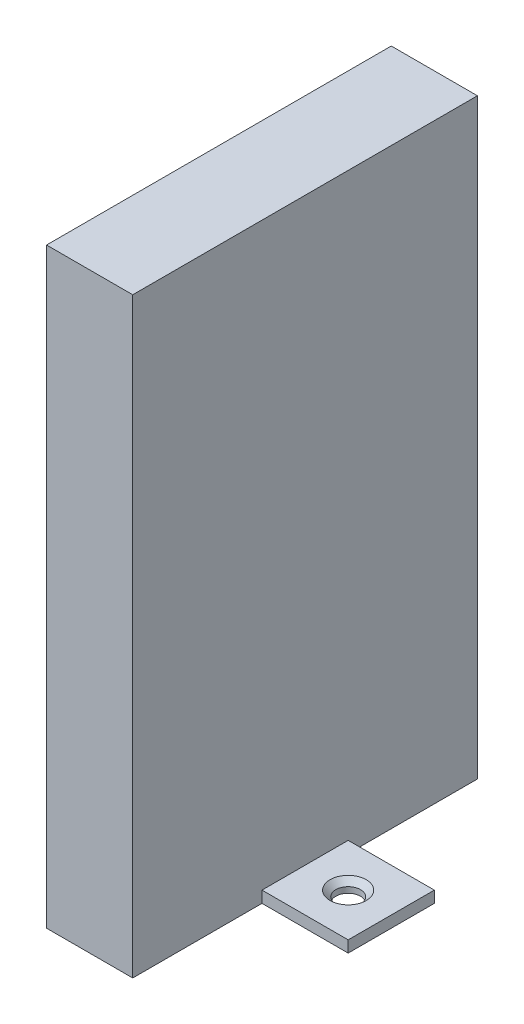
ISO-10303-21;
HEADER;
FILE_DESCRIPTION(('STEP AP214'),'2;1');
FILE_NAME('part.step','',(''),(''),'','','');
FILE_SCHEMA(('AUTOMOTIVE_DESIGN { 1 0 10303 214 1 1 1 1 }'));
ENDSEC;
DATA;
#1=APPLICATION_CONTEXT('core data for automotive mechanical design processes');
#2=APPLICATION_PROTOCOL_DEFINITION('international standard','automotive_design',2000,#1);
#3=PRODUCT_CONTEXT('',#1,'mechanical');
#4=PRODUCT('Part','Part','',(#3));
#5=PRODUCT_RELATED_PRODUCT_CATEGORY('part','',(#4));
#6=PRODUCT_DEFINITION_FORMATION('','',#4);
#7=PRODUCT_DEFINITION_CONTEXT('part definition',#1,'design');
#8=PRODUCT_DEFINITION('design','',#6,#7);
#9=PRODUCT_DEFINITION_SHAPE('','',#8);
#10=(LENGTH_UNIT() NAMED_UNIT(*) SI_UNIT(.MILLI.,.METRE.));
#11=(NAMED_UNIT(*) PLANE_ANGLE_UNIT() SI_UNIT($,.RADIAN.));
#12=(NAMED_UNIT(*) SI_UNIT($,.STERADIAN.) SOLID_ANGLE_UNIT());
#13=UNCERTAINTY_MEASURE_WITH_UNIT(LENGTH_MEASURE(1.E-05),#10,'distance_accuracy_value','');
#14=(GEOMETRIC_REPRESENTATION_CONTEXT(3) GLOBAL_UNCERTAINTY_ASSIGNED_CONTEXT((#13)) GLOBAL_UNIT_ASSIGNED_CONTEXT((#10,
#11,#12)) REPRESENTATION_CONTEXT('',''));
#15=CARTESIAN_POINT('',(0.,0.,0.));
#16=DIRECTION('',(0.,0.,1.));
#17=DIRECTION('',(1.,0.,0.));
#18=AXIS2_PLACEMENT_3D('',#15,#16,#17);
#19=CARTESIAN_POINT('',(0.,103.,0.));
#20=DIRECTION('',(1.,0.,0.));
#21=DIRECTION('',(0.,0.,-1.));
#22=AXIS2_PLACEMENT_3D('',#19,#20,#21);
#23=PLANE('',#22);
#24=DIRECTION('',(0.,-1.,0.));
#25=VECTOR('',#24,1.);
#26=CARTESIAN_POINT('',(0.,0.,-37.5));
#27=LINE('',#26,#25);
#28=CARTESIAN_POINT('',(0.,2.,-37.5));
#29=VERTEX_POINT('',#28);
#30=CARTESIAN_POINT('',(0.,0.,-37.5));
#31=VERTEX_POINT('',#30);
#32=EDGE_CURVE('E64',#29,#31,#27,.T.);
#33=ORIENTED_EDGE('',*,*,#32,.F.);
#34=DIRECTION('',(0.,0.,-1.));
#35=VECTOR('',#34,1.);
#36=CARTESIAN_POINT('',(0.,2.,-37.5));
#37=LINE('',#36,#35);
#38=CARTESIAN_POINT('',(0.,2.,-22.5));
#39=VERTEX_POINT('',#38);
#40=EDGE_CURVE('E326',#39,#29,#37,.T.);
#41=ORIENTED_EDGE('',*,*,#40,.F.);
#42=DIRECTION('',(0.,1.,0.));
#43=VECTOR('',#42,1.);
#44=CARTESIAN_POINT('',(0.,2.,-22.5));
#45=LINE('',#44,#43);
#46=CARTESIAN_POINT('',(0.,0.,-22.5));
#47=VERTEX_POINT('',#46);
#48=EDGE_CURVE('E70',#47,#39,#45,.T.);
#49=ORIENTED_EDGE('',*,*,#48,.F.);
#50=DIRECTION('',(0.,0.,1.));
#51=VECTOR('',#50,1.);
#52=CARTESIAN_POINT('',(0.,0.,0.));
#53=LINE('',#52,#51);
#54=CARTESIAN_POINT('',(0.,0.,0.));
#55=VERTEX_POINT('',#54);
#56=EDGE_CURVE('E161',#47,#55,#53,.T.);
#57=ORIENTED_EDGE('',*,*,#56,.T.);
#58=DIRECTION('',(0.,-1.,0.));
#59=VECTOR('',#58,1.);
#60=CARTESIAN_POINT('',(0.,103.,0.));
#61=LINE('',#60,#59);
#62=CARTESIAN_POINT('',(0.,103.,0.));
#63=VERTEX_POINT('',#62);
#64=EDGE_CURVE('E225',#63,#55,#61,.T.);
#65=ORIENTED_EDGE('',*,*,#64,.F.);
#66=DIRECTION('',(0.,0.,1.));
#67=VECTOR('',#66,1.);
#68=CARTESIAN_POINT('',(0.,103.,0.));
#69=LINE('',#68,#67);
#70=CARTESIAN_POINT('',(0.,103.,-60.));
#71=VERTEX_POINT('',#70);
#72=EDGE_CURVE('E222',#71,#63,#69,.T.);
#73=ORIENTED_EDGE('',*,*,#72,.F.);
#74=DIRECTION('',(0.,-1.,0.));
#75=VECTOR('',#74,1.);
#76=CARTESIAN_POINT('',(0.,103.,-60.));
#77=LINE('',#76,#75);
#78=CARTESIAN_POINT('',(0.,0.,-60.));
#79=VERTEX_POINT('',#78);
#80=EDGE_CURVE('E241',#71,#79,#77,.T.);
#81=ORIENTED_EDGE('',*,*,#80,.T.);
#82=EDGE_CURVE('E216',#79,#31,#53,.T.);
#83=ORIENTED_EDGE('',*,*,#82,.T.);
#84=EDGE_LOOP('',(#33,#41,#49,#57,#65,#73,#81,#83));
#85=FACE_BOUND('',#84,.T.);
#86=ADVANCED_FACE('F47',(#85),#23,.F.);
#87=CARTESIAN_POINT('',(15.,103.,-60.));
#88=DIRECTION('',(-1.,0.,0.));
#89=DIRECTION('',(0.,0.,1.));
#90=AXIS2_PLACEMENT_3D('',#87,#88,#89);
#91=PLANE('',#90);
#92=DIRECTION('',(0.,-1.,0.));
#93=VECTOR('',#92,1.);
#94=CARTESIAN_POINT('',(15.,0.,-22.5));
#95=LINE('',#94,#93);
#96=CARTESIAN_POINT('',(15.,2.,-22.5));
#97=VERTEX_POINT('',#96);
#98=CARTESIAN_POINT('',(15.,0.,-22.5));
#99=VERTEX_POINT('',#98);
#100=EDGE_CURVE('E179',#97,#99,#95,.T.);
#101=ORIENTED_EDGE('',*,*,#100,.F.);
#102=DIRECTION('',(0.,0.,1.));
#103=VECTOR('',#102,1.);
#104=CARTESIAN_POINT('',(15.,2.,-22.5));
#105=LINE('',#104,#103);
#106=CARTESIAN_POINT('',(15.,2.,-37.5));
#107=VERTEX_POINT('',#106);
#108=EDGE_CURVE('E168',#107,#97,#105,.T.);
#109=ORIENTED_EDGE('',*,*,#108,.F.);
#110=DIRECTION('',(0.,1.,0.));
#111=VECTOR('',#110,1.);
#112=CARTESIAN_POINT('',(15.,2.,-37.5));
#113=LINE('',#112,#111);
#114=CARTESIAN_POINT('',(15.,0.,-37.5));
#115=VERTEX_POINT('',#114);
#116=EDGE_CURVE('E163',#115,#107,#113,.T.);
#117=ORIENTED_EDGE('',*,*,#116,.F.);
#118=DIRECTION('',(0.,0.,-1.));
#119=VECTOR('',#118,1.);
#120=CARTESIAN_POINT('',(15.,0.,-60.));
#121=LINE('',#120,#119);
#122=CARTESIAN_POINT('',(15.,0.,-60.));
#123=VERTEX_POINT('',#122);
#124=EDGE_CURVE('E229',#115,#123,#121,.T.);
#125=ORIENTED_EDGE('',*,*,#124,.T.);
#126=DIRECTION('',(0.,-1.,0.));
#127=VECTOR('',#126,1.);
#128=CARTESIAN_POINT('',(15.,103.,-60.));
#129=LINE('',#128,#127);
#130=CARTESIAN_POINT('',(15.,103.,-60.));
#131=VERTEX_POINT('',#130);
#132=EDGE_CURVE('E245',#131,#123,#129,.T.);
#133=ORIENTED_EDGE('',*,*,#132,.F.);
#134=DIRECTION('',(0.,0.,-1.));
#135=VECTOR('',#134,1.);
#136=CARTESIAN_POINT('',(15.,103.,-60.));
#137=LINE('',#136,#135);
#138=CARTESIAN_POINT('',(15.,103.,0.));
#139=VERTEX_POINT('',#138);
#140=EDGE_CURVE('E215',#139,#131,#137,.T.);
#141=ORIENTED_EDGE('',*,*,#140,.F.);
#142=DIRECTION('',(0.,-1.,0.));
#143=VECTOR('',#142,1.);
#144=CARTESIAN_POINT('',(15.,103.,0.));
#145=LINE('',#144,#143);
#146=CARTESIAN_POINT('',(15.,0.,0.));
#147=VERTEX_POINT('',#146);
#148=EDGE_CURVE('E249',#139,#147,#145,.T.);
#149=ORIENTED_EDGE('',*,*,#148,.T.);
#150=EDGE_CURVE('E230',#147,#99,#121,.T.);
#151=ORIENTED_EDGE('',*,*,#150,.T.);
#152=EDGE_LOOP('',(#101,#109,#117,#125,#133,#141,#149,#151));
#153=FACE_BOUND('',#152,.T.);
#154=ADVANCED_FACE('F277',(#153),#91,.F.);
#155=CARTESIAN_POINT('',(15.,103.,0.));
#156=DIRECTION('',(0.,0.,-1.));
#157=DIRECTION('',(-1.,0.,0.));
#158=AXIS2_PLACEMENT_3D('',#155,#156,#157);
#159=PLANE('',#158);
#160=DIRECTION('',(1.,0.,0.));
#161=VECTOR('',#160,1.);
#162=CARTESIAN_POINT('',(15.,0.,0.));
#163=LINE('',#162,#161);
#164=EDGE_CURVE('E210',#55,#147,#163,.T.);
#165=ORIENTED_EDGE('',*,*,#164,.T.);
#166=ORIENTED_EDGE('',*,*,#148,.F.);
#167=DIRECTION('',(1.,0.,0.));
#168=VECTOR('',#167,1.);
#169=CARTESIAN_POINT('',(15.,103.,0.));
#170=LINE('',#169,#168);
#171=EDGE_CURVE('E211',#63,#139,#170,.T.);
#172=ORIENTED_EDGE('',*,*,#171,.F.);
#173=ORIENTED_EDGE('',*,*,#64,.T.);
#174=EDGE_LOOP('',(#165,#166,#172,#173));
#175=FACE_BOUND('',#174,.T.);
#176=ADVANCED_FACE('F284',(#175),#159,.F.);
#177=CARTESIAN_POINT('',(0.,103.,-60.));
#178=DIRECTION('',(0.,0.,1.));
#179=DIRECTION('',(1.,0.,0.));
#180=AXIS2_PLACEMENT_3D('',#177,#178,#179);
#181=PLANE('',#180);
#182=DIRECTION('',(-1.,0.,0.));
#183=VECTOR('',#182,1.);
#184=CARTESIAN_POINT('',(0.,0.,-60.));
#185=LINE('',#184,#183);
#186=EDGE_CURVE('E233',#123,#79,#185,.T.);
#187=ORIENTED_EDGE('',*,*,#186,.T.);
#188=ORIENTED_EDGE('',*,*,#80,.F.);
#189=DIRECTION('',(-1.,0.,0.));
#190=VECTOR('',#189,1.);
#191=CARTESIAN_POINT('',(0.,103.,-60.));
#192=LINE('',#191,#190);
#193=EDGE_CURVE('E219',#131,#71,#192,.T.);
#194=ORIENTED_EDGE('',*,*,#193,.F.);
#195=ORIENTED_EDGE('',*,*,#132,.T.);
#196=EDGE_LOOP('',(#187,#188,#194,#195));
#197=FACE_BOUND('',#196,.T.);
#198=ADVANCED_FACE('F290',(#197),#181,.F.);
#199=CARTESIAN_POINT('',(0.,103.,0.));
#200=DIRECTION('',(0.,-1.,0.));
#201=DIRECTION('',(0.,0.,-1.));
#202=AXIS2_PLACEMENT_3D('',#199,#200,#201);
#203=PLANE('',#202);
#204=ORIENTED_EDGE('',*,*,#171,.T.);
#205=ORIENTED_EDGE('',*,*,#140,.T.);
#206=ORIENTED_EDGE('',*,*,#193,.T.);
#207=ORIENTED_EDGE('',*,*,#72,.T.);
#208=EDGE_LOOP('',(#204,#205,#206,#207));
#209=FACE_BOUND('',#208,.T.);
#210=ADVANCED_FACE('F292',(#209),#203,.F.);
#211=CARTESIAN_POINT('',(0.,0.,0.));
#212=DIRECTION('',(0.,-1.,0.));
#213=DIRECTION('',(0.,0.,-1.));
#214=AXIS2_PLACEMENT_3D('',#211,#212,#213);
#215=PLANE('',#214);
#216=CARTESIAN_POINT('',(22.5,0.,-30.));
#217=DIRECTION('',(0.,-1.,0.));
#218=DIRECTION('',(0.,0.,-1.));
#219=AXIS2_PLACEMENT_3D('',#216,#217,#218);
#220=CIRCLE('',#219,2.15);
#221=CARTESIAN_POINT('',(22.5,0.,-32.15));
#222=VERTEX_POINT('',#221);
#223=EDGE_CURVE('E339',#222,#222,#220,.T.);
#224=ORIENTED_EDGE('',*,*,#223,.F.);
#225=EDGE_LOOP('',(#224));
#226=FACE_BOUND('',#225,.T.);
#227=CARTESIAN_POINT('',(-7.50000000000001,0.,-30.));
#228=DIRECTION('',(0.,-1.,0.));
#229=DIRECTION('',(0.,0.,-1.));
#230=AXIS2_PLACEMENT_3D('',#227,#228,#229);
#231=CIRCLE('',#230,2.15);
#232=CARTESIAN_POINT('',(-7.50000000000001,0.,-32.15));
#233=VERTEX_POINT('',#232);
#234=EDGE_CURVE('E342',#233,#233,#231,.T.);
#235=ORIENTED_EDGE('',*,*,#234,.F.);
#236=EDGE_LOOP('',(#235));
#237=FACE_BOUND('',#236,.T.);
#238=ORIENTED_EDGE('',*,*,#164,.F.);
#239=ORIENTED_EDGE('',*,*,#56,.F.);
#240=DIRECTION('',(1.,0.,0.));
#241=VECTOR('',#240,1.);
#242=CARTESIAN_POINT('',(-15.,0.,-22.5));
#243=LINE('',#242,#241);
#244=CARTESIAN_POINT('',(-15.,0.,-22.5));
#245=VERTEX_POINT('',#244);
#246=EDGE_CURVE('E141',#245,#47,#243,.T.);
#247=ORIENTED_EDGE('',*,*,#246,.F.);
#248=DIRECTION('',(0.,0.,1.));
#249=VECTOR('',#248,1.);
#250=CARTESIAN_POINT('',(-15.,0.,-22.5));
#251=LINE('',#250,#249);
#252=CARTESIAN_POINT('',(-15.,0.,-37.5));
#253=VERTEX_POINT('',#252);
#254=EDGE_CURVE('E148',#253,#245,#251,.T.);
#255=ORIENTED_EDGE('',*,*,#254,.F.);
#256=DIRECTION('',(1.,0.,0.));
#257=VECTOR('',#256,1.);
#258=CARTESIAN_POINT('',(-15.,0.,-37.5));
#259=LINE('',#258,#257);
#260=EDGE_CURVE('E320',#253,#31,#259,.T.);
#261=ORIENTED_EDGE('',*,*,#260,.T.);
#262=ORIENTED_EDGE('',*,*,#82,.F.);
#263=ORIENTED_EDGE('',*,*,#186,.F.);
#264=ORIENTED_EDGE('',*,*,#124,.F.);
#265=DIRECTION('',(-1.,0.,0.));
#266=VECTOR('',#265,1.);
#267=CARTESIAN_POINT('',(30.,0.,-37.5));
#268=LINE('',#267,#266);
#269=CARTESIAN_POINT('',(30.,0.,-37.5));
#270=VERTEX_POINT('',#269);
#271=EDGE_CURVE('E206',#270,#115,#268,.T.);
#272=ORIENTED_EDGE('',*,*,#271,.F.);
#273=DIRECTION('',(0.,0.,-1.));
#274=VECTOR('',#273,1.);
#275=CARTESIAN_POINT('',(30.,0.,-37.5));
#276=LINE('',#275,#274);
#277=CARTESIAN_POINT('',(30.,0.,-22.5));
#278=VERTEX_POINT('',#277);
#279=EDGE_CURVE('E174',#278,#270,#276,.T.);
#280=ORIENTED_EDGE('',*,*,#279,.F.);
#281=DIRECTION('',(-1.,0.,0.));
#282=VECTOR('',#281,1.);
#283=CARTESIAN_POINT('',(30.,0.,-22.5));
#284=LINE('',#283,#282);
#285=EDGE_CURVE('E187',#278,#99,#284,.T.);
#286=ORIENTED_EDGE('',*,*,#285,.T.);
#287=ORIENTED_EDGE('',*,*,#150,.F.);
#288=EDGE_LOOP('',(#238,#239,#247,#255,#261,#262,#263,#264,#272,#280,#286,#287));
#289=FACE_BOUND('',#288,.T.);
#290=ADVANCED_FACE('F160',(#226,#237,#289),#215,.T.);
#291=CARTESIAN_POINT('',(30.,2.,-37.5));
#292=DIRECTION('',(0.,0.,1.));
#293=DIRECTION('',(1.,0.,0.));
#294=AXIS2_PLACEMENT_3D('',#291,#292,#293);
#295=PLANE('',#294);
#296=ORIENTED_EDGE('',*,*,#116,.T.);
#297=DIRECTION('',(-1.,0.,0.));
#298=VECTOR('',#297,1.);
#299=CARTESIAN_POINT('',(30.,2.,-37.5));
#300=LINE('',#299,#298);
#301=CARTESIAN_POINT('',(30.,2.,-37.5));
#302=VERTEX_POINT('',#301);
#303=EDGE_CURVE('E202',#302,#107,#300,.T.);
#304=ORIENTED_EDGE('',*,*,#303,.F.);
#305=DIRECTION('',(0.,1.,0.));
#306=VECTOR('',#305,1.);
#307=CARTESIAN_POINT('',(30.,2.,-37.5));
#308=LINE('',#307,#306);
#309=EDGE_CURVE('E178',#270,#302,#308,.T.);
#310=ORIENTED_EDGE('',*,*,#309,.F.);
#311=ORIENTED_EDGE('',*,*,#271,.T.);
#312=EDGE_LOOP('',(#296,#304,#310,#311));
#313=FACE_BOUND('',#312,.T.);
#314=ADVANCED_FACE('F352',(#313),#295,.F.);
#315=CARTESIAN_POINT('',(30.,2.,-22.5));
#316=DIRECTION('',(0.,-1.,0.));
#317=DIRECTION('',(0.,0.,-1.));
#318=AXIS2_PLACEMENT_3D('',#315,#316,#317);
#319=PLANE('',#318);
#320=CARTESIAN_POINT('',(22.5,2.,-30.));
#321=DIRECTION('',(0.,-1.,0.));
#322=DIRECTION('',(0.,0.,-1.));
#323=AXIS2_PLACEMENT_3D('',#320,#321,#322);
#324=CIRCLE('',#323,3.15);
#325=CARTESIAN_POINT('',(22.5,2.,-33.15));
#326=VERTEX_POINT('',#325);
#327=EDGE_CURVE('E257',#326,#326,#324,.T.);
#328=ORIENTED_EDGE('',*,*,#327,.T.);
#329=EDGE_LOOP('',(#328));
#330=FACE_BOUND('',#329,.T.);
#331=ORIENTED_EDGE('',*,*,#108,.T.);
#332=DIRECTION('',(-1.,0.,0.));
#333=VECTOR('',#332,1.);
#334=CARTESIAN_POINT('',(30.,2.,-22.5));
#335=LINE('',#334,#333);
#336=CARTESIAN_POINT('',(30.,2.,-22.5));
#337=VERTEX_POINT('',#336);
#338=EDGE_CURVE('E198',#337,#97,#335,.T.);
#339=ORIENTED_EDGE('',*,*,#338,.F.);
#340=DIRECTION('',(0.,0.,1.));
#341=VECTOR('',#340,1.);
#342=CARTESIAN_POINT('',(30.,2.,-22.5));
#343=LINE('',#342,#341);
#344=EDGE_CURVE('E182',#302,#337,#343,.T.);
#345=ORIENTED_EDGE('',*,*,#344,.F.);
#346=ORIENTED_EDGE('',*,*,#303,.T.);
#347=EDGE_LOOP('',(#331,#339,#345,#346));
#348=FACE_BOUND('',#347,.T.);
#349=ADVANCED_FACE('F359',(#330,#348),#319,.F.);
#350=CARTESIAN_POINT('',(30.,0.,-22.5));
#351=DIRECTION('',(0.,0.,-1.));
#352=DIRECTION('',(-1.,0.,0.));
#353=AXIS2_PLACEMENT_3D('',#350,#351,#352);
#354=PLANE('',#353);
#355=ORIENTED_EDGE('',*,*,#100,.T.);
#356=ORIENTED_EDGE('',*,*,#285,.F.);
#357=DIRECTION('',(0.,-1.,0.));
#358=VECTOR('',#357,1.);
#359=CARTESIAN_POINT('',(30.,0.,-22.5));
#360=LINE('',#359,#358);
#361=EDGE_CURVE('E185',#337,#278,#360,.T.);
#362=ORIENTED_EDGE('',*,*,#361,.F.);
#363=ORIENTED_EDGE('',*,*,#338,.T.);
#364=EDGE_LOOP('',(#355,#356,#362,#363));
#365=FACE_BOUND('',#364,.T.);
#366=ADVANCED_FACE('F367',(#365),#354,.F.);
#367=CARTESIAN_POINT('',(30.,0.,0.));
#368=DIRECTION('',(-1.,0.,0.));
#369=DIRECTION('',(0.,0.,1.));
#370=AXIS2_PLACEMENT_3D('',#367,#368,#369);
#371=PLANE('',#370);
#372=ORIENTED_EDGE('',*,*,#279,.T.);
#373=ORIENTED_EDGE('',*,*,#309,.T.);
#374=ORIENTED_EDGE('',*,*,#344,.T.);
#375=ORIENTED_EDGE('',*,*,#361,.T.);
#376=EDGE_LOOP('',(#372,#373,#374,#375));
#377=FACE_BOUND('',#376,.T.);
#378=ADVANCED_FACE('F371',(#377),#371,.F.);
#379=CARTESIAN_POINT('',(-15.,2.,-22.5));
#380=DIRECTION('',(0.,0.,-1.));
#381=DIRECTION('',(-1.,0.,0.));
#382=AXIS2_PLACEMENT_3D('',#379,#380,#381);
#383=PLANE('',#382);
#384=ORIENTED_EDGE('',*,*,#48,.T.);
#385=DIRECTION('',(1.,0.,0.));
#386=VECTOR('',#385,1.);
#387=CARTESIAN_POINT('',(-15.,2.,-22.5));
#388=LINE('',#387,#386);
#389=CARTESIAN_POINT('',(-15.,2.,-22.5));
#390=VERTEX_POINT('',#389);
#391=EDGE_CURVE('E143',#390,#39,#388,.T.);
#392=ORIENTED_EDGE('',*,*,#391,.F.);
#393=DIRECTION('',(0.,1.,0.));
#394=VECTOR('',#393,1.);
#395=CARTESIAN_POINT('',(-15.,2.,-22.5));
#396=LINE('',#395,#394);
#397=EDGE_CURVE('E137',#245,#390,#396,.T.);
#398=ORIENTED_EDGE('',*,*,#397,.F.);
#399=ORIENTED_EDGE('',*,*,#246,.T.);
#400=EDGE_LOOP('',(#384,#392,#398,#399));
#401=FACE_BOUND('',#400,.T.);
#402=ADVANCED_FACE('F139',(#401),#383,.F.);
#403=CARTESIAN_POINT('',(-15.,2.,-37.5));
#404=DIRECTION('',(0.,-1.,0.));
#405=DIRECTION('',(0.,0.,-1.));
#406=AXIS2_PLACEMENT_3D('',#403,#404,#405);
#407=PLANE('',#406);
#408=CARTESIAN_POINT('',(-7.50000000000001,2.,-30.));
#409=DIRECTION('',(0.,-1.,0.));
#410=DIRECTION('',(0.,0.,-1.));
#411=AXIS2_PLACEMENT_3D('',#408,#409,#410);
#412=CIRCLE('',#411,3.15);
#413=CARTESIAN_POINT('',(-7.50000000000001,2.,-33.15));
#414=VERTEX_POINT('',#413);
#415=EDGE_CURVE('E11',#414,#414,#412,.T.);
#416=ORIENTED_EDGE('',*,*,#415,.T.);
#417=EDGE_LOOP('',(#416));
#418=FACE_BOUND('',#417,.T.);
#419=ORIENTED_EDGE('',*,*,#40,.T.);
#420=DIRECTION('',(1.,0.,0.));
#421=VECTOR('',#420,1.);
#422=CARTESIAN_POINT('',(-15.,2.,-37.5));
#423=LINE('',#422,#421);
#424=CARTESIAN_POINT('',(-15.,2.,-37.5));
#425=VERTEX_POINT('',#424);
#426=EDGE_CURVE('E170',#425,#29,#423,.T.);
#427=ORIENTED_EDGE('',*,*,#426,.F.);
#428=DIRECTION('',(0.,0.,-1.));
#429=VECTOR('',#428,1.);
#430=CARTESIAN_POINT('',(-15.,2.,-37.5));
#431=LINE('',#430,#429);
#432=EDGE_CURVE('E147',#390,#425,#431,.T.);
#433=ORIENTED_EDGE('',*,*,#432,.F.);
#434=ORIENTED_EDGE('',*,*,#391,.T.);
#435=EDGE_LOOP('',(#419,#427,#433,#434));
#436=FACE_BOUND('',#435,.T.);
#437=ADVANCED_FACE('F376',(#418,#436),#407,.F.);
#438=CARTESIAN_POINT('',(-15.,0.,-37.5));
#439=DIRECTION('',(0.,0.,1.));
#440=DIRECTION('',(1.,0.,0.));
#441=AXIS2_PLACEMENT_3D('',#438,#439,#440);
#442=PLANE('',#441);
#443=ORIENTED_EDGE('',*,*,#32,.T.);
#444=ORIENTED_EDGE('',*,*,#260,.F.);
#445=DIRECTION('',(0.,-1.,0.));
#446=VECTOR('',#445,1.);
#447=CARTESIAN_POINT('',(-15.,0.,-37.5));
#448=LINE('',#447,#446);
#449=EDGE_CURVE('E153',#425,#253,#448,.T.);
#450=ORIENTED_EDGE('',*,*,#449,.F.);
#451=ORIENTED_EDGE('',*,*,#426,.T.);
#452=EDGE_LOOP('',(#443,#444,#450,#451));
#453=FACE_BOUND('',#452,.T.);
#454=ADVANCED_FACE('F323',(#453),#442,.F.);
#455=CARTESIAN_POINT('',(-15.,0.,0.));
#456=DIRECTION('',(1.,0.,0.));
#457=DIRECTION('',(0.,0.,-1.));
#458=AXIS2_PLACEMENT_3D('',#455,#456,#457);
#459=PLANE('',#458);
#460=ORIENTED_EDGE('',*,*,#254,.T.);
#461=ORIENTED_EDGE('',*,*,#397,.T.);
#462=ORIENTED_EDGE('',*,*,#432,.T.);
#463=ORIENTED_EDGE('',*,*,#449,.T.);
#464=EDGE_LOOP('',(#460,#461,#462,#463));
#465=FACE_BOUND('',#464,.T.);
#466=ADVANCED_FACE('F151',(#465),#459,.F.);
#467=CARTESIAN_POINT('',(-7.50000000000001,-13.,-30.));
#468=DIRECTION('',(0.,1.,0.));
#469=DIRECTION('',(0.,0.,1.));
#470=AXIS2_PLACEMENT_3D('',#467,#468,#469);
#471=CYLINDRICAL_SURFACE('',#470,2.15);
#472=CARTESIAN_POINT('',(-7.50000000000001,1.00000000000001,-30.));
#473=DIRECTION('',(0.,-1.,0.));
#474=DIRECTION('',(0.,0.,-1.));
#475=AXIS2_PLACEMENT_3D('',#472,#473,#474);
#476=CIRCLE('',#475,2.15);
#477=CARTESIAN_POINT('',(-7.50000000000001,1.00000000000001,-32.15));
#478=VERTEX_POINT('',#477);
#479=EDGE_CURVE('E57',#478,#478,#476,.F.);
#480=ORIENTED_EDGE('',*,*,#479,.T.);
#481=EDGE_LOOP('',(#480));
#482=FACE_BOUND('',#481,.T.);
#483=ORIENTED_EDGE('',*,*,#234,.T.);
#484=EDGE_LOOP('',(#483));
#485=FACE_BOUND('',#484,.T.);
#486=ADVANCED_FACE('F264',(#482,#485),#471,.F.);
#487=CARTESIAN_POINT('',(22.5,-13.,-30.));
#488=DIRECTION('',(0.,1.,0.));
#489=DIRECTION('',(0.,0.,1.));
#490=AXIS2_PLACEMENT_3D('',#487,#488,#489);
#491=CYLINDRICAL_SURFACE('',#490,2.15);
#492=CARTESIAN_POINT('',(22.5,1.,-30.));
#493=DIRECTION('',(0.,-1.,0.));
#494=DIRECTION('',(0.,0.,-1.));
#495=AXIS2_PLACEMENT_3D('',#492,#493,#494);
#496=CIRCLE('',#495,2.15);
#497=CARTESIAN_POINT('',(22.5,1.,-32.15));
#498=VERTEX_POINT('',#497);
#499=EDGE_CURVE('E253',#498,#498,#496,.F.);
#500=ORIENTED_EDGE('',*,*,#499,.T.);
#501=EDGE_LOOP('',(#500));
#502=FACE_BOUND('',#501,.T.);
#503=ORIENTED_EDGE('',*,*,#223,.T.);
#504=EDGE_LOOP('',(#503));
#505=FACE_BOUND('',#504,.T.);
#506=ADVANCED_FACE('F273',(#502,#505),#491,.F.);
#507=CARTESIAN_POINT('',(22.5,1.,-30.));
#508=DIRECTION('',(0.,1.,0.));
#509=DIRECTION('',(0.,0.,1.));
#510=AXIS2_PLACEMENT_3D('',#507,#508,#509);
#511=CONICAL_SURFACE('',#510,2.15,0.785398163397451);
#512=ORIENTED_EDGE('',*,*,#327,.F.);
#513=EDGE_LOOP('',(#512));
#514=FACE_BOUND('',#513,.T.);
#515=ORIENTED_EDGE('',*,*,#499,.F.);
#516=EDGE_LOOP('',(#515));
#517=FACE_BOUND('',#516,.T.);
#518=ADVANCED_FACE('F268',(#514,#517),#511,.F.);
#519=CARTESIAN_POINT('',(-7.50000000000001,1.00000000000001,-30.));
#520=DIRECTION('',(0.,1.,0.));
#521=DIRECTION('',(0.,0.,1.));
#522=AXIS2_PLACEMENT_3D('',#519,#520,#521);
#523=CONICAL_SURFACE('',#522,2.15,0.785398163397453);
#524=ORIENTED_EDGE('',*,*,#415,.F.);
#525=EDGE_LOOP('',(#524));
#526=FACE_BOUND('',#525,.T.);
#527=ORIENTED_EDGE('',*,*,#479,.F.);
#528=EDGE_LOOP('',(#527));
#529=FACE_BOUND('',#528,.T.);
#530=ADVANCED_FACE('F50',(#526,#529),#523,.F.);
#531=CLOSED_SHELL('',(#86,#154,#176,#198,#210,#290,#314,#349,#366,#378,#402,#437,#454,#466,#486,
#506,#518,#530));
#532=MANIFOLD_SOLID_BREP('B2',#531);
#533=ADVANCED_BREP_SHAPE_REPRESENTATION('',(#18,#532),#14);
#534=SHAPE_DEFINITION_REPRESENTATION(#9,#533);
ENDSEC;
END-ISO-10303-21;
